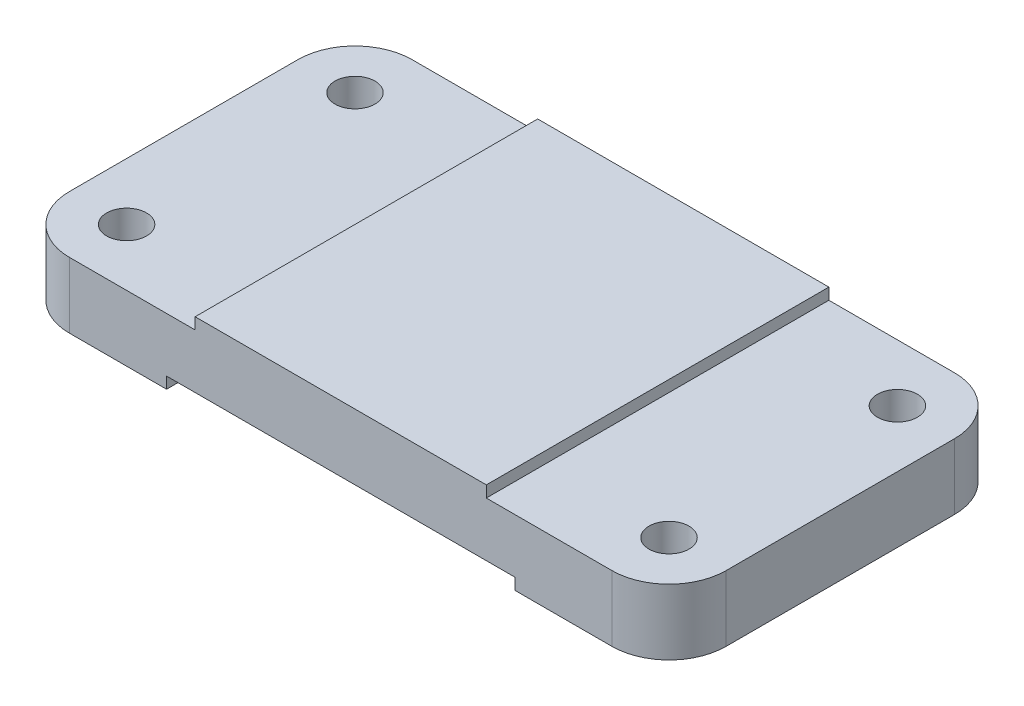
ISO-10303-21;
HEADER;
FILE_DESCRIPTION(('STEP AP214'),'2;1');
FILE_NAME('part.step','',(''),(''),'','','');
FILE_SCHEMA(('AUTOMOTIVE_DESIGN { 1 0 10303 214 1 1 1 1 }'));
ENDSEC;
DATA;
#1=APPLICATION_CONTEXT('core data for automotive mechanical design processes');
#2=APPLICATION_PROTOCOL_DEFINITION('international standard','automotive_design',2000,#1);
#3=PRODUCT_CONTEXT('',#1,'mechanical');
#4=PRODUCT('Part','Part','',(#3));
#5=PRODUCT_RELATED_PRODUCT_CATEGORY('part','',(#4));
#6=PRODUCT_DEFINITION_FORMATION('','',#4);
#7=PRODUCT_DEFINITION_CONTEXT('part definition',#1,'design');
#8=PRODUCT_DEFINITION('design','',#6,#7);
#9=PRODUCT_DEFINITION_SHAPE('','',#8);
#10=(LENGTH_UNIT() NAMED_UNIT(*) SI_UNIT(.MILLI.,.METRE.));
#11=(NAMED_UNIT(*) PLANE_ANGLE_UNIT() SI_UNIT($,.RADIAN.));
#12=(NAMED_UNIT(*) SI_UNIT($,.STERADIAN.) SOLID_ANGLE_UNIT());
#13=UNCERTAINTY_MEASURE_WITH_UNIT(LENGTH_MEASURE(1.E-05),#10,'distance_accuracy_value','');
#14=(GEOMETRIC_REPRESENTATION_CONTEXT(3) GLOBAL_UNCERTAINTY_ASSIGNED_CONTEXT((#13)) GLOBAL_UNIT_ASSIGNED_CONTEXT((#10,
#11,#12)) REPRESENTATION_CONTEXT('',''));
#15=CARTESIAN_POINT('',(0.,0.,0.));
#16=DIRECTION('',(0.,0.,1.));
#17=DIRECTION('',(1.,0.,0.));
#18=AXIS2_PLACEMENT_3D('',#15,#16,#17);
#19=CARTESIAN_POINT('',(95.,0.,-40.));
#20=DIRECTION('',(0.,-1.,0.));
#21=DIRECTION('',(0.,0.,-1.));
#22=AXIS2_PLACEMENT_3D('',#19,#20,#21);
#23=PLANE('',#22);
#24=CARTESIAN_POINT('',(95.,0.,-40.));
#25=DIRECTION('',(0.,1.,0.));
#26=DIRECTION('',(0.,0.,1.));
#27=AXIS2_PLACEMENT_3D('',#24,#25,#26);
#28=CIRCLE('',#27,6.99999999999999);
#29=CARTESIAN_POINT('',(95.,0.,-33.));
#30=VERTEX_POINT('',#29);
#31=EDGE_CURVE('E417',#30,#30,#28,.T.);
#32=ORIENTED_EDGE('',*,*,#31,.T.);
#33=EDGE_LOOP('',(#32));
#34=FACE_BOUND('',#33,.T.);
#35=CARTESIAN_POINT('',(95.,0.,40.));
#36=DIRECTION('',(0.,1.,0.));
#37=DIRECTION('',(0.,0.,1.));
#38=AXIS2_PLACEMENT_3D('',#35,#36,#37);
#39=CIRCLE('',#38,6.99999999999999);
#40=CARTESIAN_POINT('',(95.,0.,47.));
#41=VERTEX_POINT('',#40);
#42=EDGE_CURVE('E196',#41,#41,#39,.T.);
#43=ORIENTED_EDGE('',*,*,#42,.T.);
#44=EDGE_LOOP('',(#43));
#45=FACE_BOUND('',#44,.T.);
#46=DIRECTION('',(0.,0.,1.));
#47=VECTOR('',#46,1.);
#48=CARTESIAN_POINT('',(61.,0.,60.));
#49=LINE('',#48,#47);
#50=CARTESIAN_POINT('',(61.,0.,-60.));
#51=VERTEX_POINT('',#50);
#52=CARTESIAN_POINT('',(61.,0.,60.));
#53=VERTEX_POINT('',#52);
#54=EDGE_CURVE('E166',#51,#53,#49,.T.);
#55=ORIENTED_EDGE('',*,*,#54,.F.);
#56=DIRECTION('',(-1.,0.,0.));
#57=VECTOR('',#56,1.);
#58=CARTESIAN_POINT('',(-95.,0.,-60.));
#59=LINE('',#58,#57);
#60=CARTESIAN_POINT('',(95.,0.,-60.));
#61=VERTEX_POINT('',#60);
#62=EDGE_CURVE('E277',#61,#51,#59,.T.);
#63=ORIENTED_EDGE('',*,*,#62,.F.);
#64=CARTESIAN_POINT('',(95.,0.,-40.));
#65=DIRECTION('',(0.,1.,0.));
#66=DIRECTION('',(0.,0.,-1.));
#67=AXIS2_PLACEMENT_3D('',#64,#65,#66);
#68=CIRCLE('',#67,20.);
#69=CARTESIAN_POINT('',(115.,0.,-40.));
#70=VERTEX_POINT('',#69);
#71=EDGE_CURVE('E243',#70,#61,#68,.T.);
#72=ORIENTED_EDGE('',*,*,#71,.F.);
#73=DIRECTION('',(0.,0.,-1.));
#74=VECTOR('',#73,1.);
#75=CARTESIAN_POINT('',(115.,0.,-40.));
#76=LINE('',#75,#74);
#77=CARTESIAN_POINT('',(115.,0.,40.));
#78=VERTEX_POINT('',#77);
#79=EDGE_CURVE('E249',#78,#70,#76,.T.);
#80=ORIENTED_EDGE('',*,*,#79,.F.);
#81=CARTESIAN_POINT('',(95.,0.,40.));
#82=DIRECTION('',(0.,1.,0.));
#83=DIRECTION('',(0.,0.,-1.));
#84=AXIS2_PLACEMENT_3D('',#81,#82,#83);
#85=CIRCLE('',#84,20.);
#86=CARTESIAN_POINT('',(95.,0.,60.));
#87=VERTEX_POINT('',#86);
#88=EDGE_CURVE('E294',#87,#78,#85,.T.);
#89=ORIENTED_EDGE('',*,*,#88,.F.);
#90=DIRECTION('',(1.,0.,0.));
#91=VECTOR('',#90,1.);
#92=CARTESIAN_POINT('',(-95.,0.,60.));
#93=LINE('',#92,#91);
#94=EDGE_CURVE('E290',#53,#87,#93,.T.);
#95=ORIENTED_EDGE('',*,*,#94,.F.);
#96=EDGE_LOOP('',(#55,#63,#72,#80,#89,#95));
#97=FACE_BOUND('',#96,.T.);
#98=ADVANCED_FACE('F47',(#34,#45,#97),#23,.T.);
#99=CARTESIAN_POINT('',(95.,23.,-40.));
#100=DIRECTION('',(0.,-1.,0.));
#101=DIRECTION('',(0.,0.,-1.));
#102=AXIS2_PLACEMENT_3D('',#99,#100,#101);
#103=PLANE('',#102);
#104=CARTESIAN_POINT('',(95.,23.,-40.));
#105=DIRECTION('',(0.,1.,0.));
#106=DIRECTION('',(0.,0.,1.));
#107=AXIS2_PLACEMENT_3D('',#104,#105,#106);
#108=CIRCLE('',#107,6.99999999999999);
#109=CARTESIAN_POINT('',(95.,23.,-33.));
#110=VERTEX_POINT('',#109);
#111=EDGE_CURVE('E411',#110,#110,#108,.T.);
#112=ORIENTED_EDGE('',*,*,#111,.F.);
#113=EDGE_LOOP('',(#112));
#114=FACE_BOUND('',#113,.T.);
#115=CARTESIAN_POINT('',(95.,23.,40.));
#116=DIRECTION('',(0.,1.,0.));
#117=DIRECTION('',(0.,0.,1.));
#118=AXIS2_PLACEMENT_3D('',#115,#116,#117);
#119=CIRCLE('',#118,6.99999999999999);
#120=CARTESIAN_POINT('',(95.,23.,47.));
#121=VERTEX_POINT('',#120);
#122=EDGE_CURVE('E425',#121,#121,#119,.T.);
#123=ORIENTED_EDGE('',*,*,#122,.F.);
#124=EDGE_LOOP('',(#123));
#125=FACE_BOUND('',#124,.T.);
#126=DIRECTION('',(0.,0.,-1.));
#127=VECTOR('',#126,1.);
#128=CARTESIAN_POINT('',(51.,23.,-60.));
#129=LINE('',#128,#127);
#130=CARTESIAN_POINT('',(51.,23.,60.));
#131=VERTEX_POINT('',#130);
#132=CARTESIAN_POINT('',(51.,23.,-60.));
#133=VERTEX_POINT('',#132);
#134=EDGE_CURVE('E71',#131,#133,#129,.T.);
#135=ORIENTED_EDGE('',*,*,#134,.F.);
#136=DIRECTION('',(1.,0.,0.));
#137=VECTOR('',#136,1.);
#138=CARTESIAN_POINT('',(-95.,23.,60.));
#139=LINE('',#138,#137);
#140=CARTESIAN_POINT('',(95.,23.,60.));
#141=VERTEX_POINT('',#140);
#142=EDGE_CURVE('E262',#131,#141,#139,.T.);
#143=ORIENTED_EDGE('',*,*,#142,.T.);
#144=CARTESIAN_POINT('',(95.,23.,40.));
#145=DIRECTION('',(0.,1.,0.));
#146=DIRECTION('',(0.,0.,-1.));
#147=AXIS2_PLACEMENT_3D('',#144,#145,#146);
#148=CIRCLE('',#147,20.);
#149=CARTESIAN_POINT('',(115.,23.,40.));
#150=VERTEX_POINT('',#149);
#151=EDGE_CURVE('E266',#141,#150,#148,.T.);
#152=ORIENTED_EDGE('',*,*,#151,.T.);
#153=DIRECTION('',(0.,0.,-1.));
#154=VECTOR('',#153,1.);
#155=CARTESIAN_POINT('',(115.,23.,-40.));
#156=LINE('',#155,#154);
#157=CARTESIAN_POINT('',(115.,23.,-40.));
#158=VERTEX_POINT('',#157);
#159=EDGE_CURVE('E269',#150,#158,#156,.T.);
#160=ORIENTED_EDGE('',*,*,#159,.T.);
#161=CARTESIAN_POINT('',(95.,23.,-40.));
#162=DIRECTION('',(0.,1.,0.));
#163=DIRECTION('',(0.,0.,-1.));
#164=AXIS2_PLACEMENT_3D('',#161,#162,#163);
#165=CIRCLE('',#164,20.);
#166=CARTESIAN_POINT('',(95.,23.,-60.));
#167=VERTEX_POINT('',#166);
#168=EDGE_CURVE('E244',#158,#167,#165,.T.);
#169=ORIENTED_EDGE('',*,*,#168,.T.);
#170=DIRECTION('',(-1.,0.,0.));
#171=VECTOR('',#170,1.);
#172=CARTESIAN_POINT('',(-95.,23.,-60.));
#173=LINE('',#172,#171);
#174=EDGE_CURVE('E250',#167,#133,#173,.T.);
#175=ORIENTED_EDGE('',*,*,#174,.T.);
#176=EDGE_LOOP('',(#135,#143,#152,#160,#169,#175));
#177=FACE_BOUND('',#176,.T.);
#178=ADVANCED_FACE('F369',(#114,#125,#177),#103,.F.);
#179=CARTESIAN_POINT('',(-95.,23.,-40.));
#180=DIRECTION('',(0.,1.,0.));
#181=DIRECTION('',(0.,0.,1.));
#182=AXIS2_PLACEMENT_3D('',#179,#180,#181);
#183=CIRCLE('',#182,6.99999999999999);
#184=CARTESIAN_POINT('',(-95.,23.,-33.));
#185=VERTEX_POINT('',#184);
#186=EDGE_CURVE('E677',#185,#185,#183,.T.);
#187=ORIENTED_EDGE('',*,*,#186,.F.);
#188=EDGE_LOOP('',(#187));
#189=FACE_BOUND('',#188,.T.);
#190=CARTESIAN_POINT('',(-95.,23.,40.));
#191=DIRECTION('',(0.,1.,0.));
#192=DIRECTION('',(0.,0.,1.));
#193=AXIS2_PLACEMENT_3D('',#190,#191,#192);
#194=CIRCLE('',#193,6.99999999999999);
#195=CARTESIAN_POINT('',(-95.,23.,47.));
#196=VERTEX_POINT('',#195);
#197=EDGE_CURVE('E412',#196,#196,#194,.T.);
#198=ORIENTED_EDGE('',*,*,#197,.F.);
#199=EDGE_LOOP('',(#198));
#200=FACE_BOUND('',#199,.T.);
#201=DIRECTION('',(0.,0.,1.));
#202=VECTOR('',#201,1.);
#203=CARTESIAN_POINT('',(-51.,23.,-60.));
#204=LINE('',#203,#202);
#205=CARTESIAN_POINT('',(-51.,23.,-60.));
#206=VERTEX_POINT('',#205);
#207=CARTESIAN_POINT('',(-51.,23.,60.));
#208=VERTEX_POINT('',#207);
#209=EDGE_CURVE('E213',#206,#208,#204,.T.);
#210=ORIENTED_EDGE('',*,*,#209,.F.);
#211=CARTESIAN_POINT('',(-95.,23.,-60.));
#212=VERTEX_POINT('',#211);
#213=EDGE_CURVE('E248',#206,#212,#173,.T.);
#214=ORIENTED_EDGE('',*,*,#213,.T.);
#215=CARTESIAN_POINT('',(-95.,23.,-40.));
#216=DIRECTION('',(0.,1.,0.));
#217=DIRECTION('',(0.,0.,1.));
#218=AXIS2_PLACEMENT_3D('',#215,#216,#217);
#219=CIRCLE('',#218,20.);
#220=CARTESIAN_POINT('',(-115.,23.,-40.));
#221=VERTEX_POINT('',#220);
#222=EDGE_CURVE('E253',#212,#221,#219,.T.);
#223=ORIENTED_EDGE('',*,*,#222,.T.);
#224=DIRECTION('',(0.,0.,1.));
#225=VECTOR('',#224,1.);
#226=CARTESIAN_POINT('',(-115.,23.,-40.));
#227=LINE('',#226,#225);
#228=CARTESIAN_POINT('',(-115.,23.,40.));
#229=VERTEX_POINT('',#228);
#230=EDGE_CURVE('E256',#221,#229,#227,.T.);
#231=ORIENTED_EDGE('',*,*,#230,.T.);
#232=CARTESIAN_POINT('',(-95.,23.,40.));
#233=DIRECTION('',(0.,1.,0.));
#234=DIRECTION('',(0.,0.,1.));
#235=AXIS2_PLACEMENT_3D('',#232,#233,#234);
#236=CIRCLE('',#235,20.);
#237=CARTESIAN_POINT('',(-95.,23.,60.));
#238=VERTEX_POINT('',#237);
#239=EDGE_CURVE('E259',#229,#238,#236,.T.);
#240=ORIENTED_EDGE('',*,*,#239,.T.);
#241=EDGE_CURVE('E263',#238,#208,#139,.T.);
#242=ORIENTED_EDGE('',*,*,#241,.T.);
#243=EDGE_LOOP('',(#210,#214,#223,#231,#240,#242));
#244=FACE_BOUND('',#243,.T.);
#245=ADVANCED_FACE('F347',(#189,#200,#244),#103,.F.);
#246=CARTESIAN_POINT('',(95.,23.,-40.));
#247=DIRECTION('',(0.,-1.,0.));
#248=DIRECTION('',(0.,0.,-1.));
#249=AXIS2_PLACEMENT_3D('',#246,#247,#248);
#250=CYLINDRICAL_SURFACE('',#249,20.);
#251=ORIENTED_EDGE('',*,*,#71,.T.);
#252=DIRECTION('',(0.,-1.,0.));
#253=VECTOR('',#252,1.);
#254=CARTESIAN_POINT('',(95.,23.,-60.));
#255=LINE('',#254,#253);
#256=EDGE_CURVE('E11',#167,#61,#255,.T.);
#257=ORIENTED_EDGE('',*,*,#256,.F.);
#258=ORIENTED_EDGE('',*,*,#168,.F.);
#259=DIRECTION('',(0.,-1.,0.));
#260=VECTOR('',#259,1.);
#261=CARTESIAN_POINT('',(115.,23.,-40.));
#262=LINE('',#261,#260);
#263=EDGE_CURVE('E272',#158,#70,#262,.T.);
#264=ORIENTED_EDGE('',*,*,#263,.T.);
#265=EDGE_LOOP('',(#251,#257,#258,#264));
#266=FACE_BOUND('',#265,.T.);
#267=ADVANCED_FACE('F49',(#266),#250,.T.);
#268=CARTESIAN_POINT('',(-95.,23.,-60.));
#269=DIRECTION('',(0.,0.,1.));
#270=DIRECTION('',(1.,0.,0.));
#271=AXIS2_PLACEMENT_3D('',#268,#269,#270);
#272=PLANE('',#271);
#273=ORIENTED_EDGE('',*,*,#62,.T.);
#274=DIRECTION('',(0.,-1.,0.));
#275=VECTOR('',#274,1.);
#276=CARTESIAN_POINT('',(61.,4.,-60.));
#277=LINE('',#276,#275);
#278=CARTESIAN_POINT('',(61.,4.,-60.));
#279=VERTEX_POINT('',#278);
#280=EDGE_CURVE('E199',#279,#51,#277,.T.);
#281=ORIENTED_EDGE('',*,*,#280,.F.);
#282=DIRECTION('',(1.,0.,0.));
#283=VECTOR('',#282,1.);
#284=CARTESIAN_POINT('',(-61.,4.,-60.));
#285=LINE('',#284,#283);
#286=CARTESIAN_POINT('',(-61.,4.,-60.));
#287=VERTEX_POINT('',#286);
#288=EDGE_CURVE('E171',#287,#279,#285,.T.);
#289=ORIENTED_EDGE('',*,*,#288,.F.);
#290=DIRECTION('',(0.,-1.,0.));
#291=VECTOR('',#290,1.);
#292=CARTESIAN_POINT('',(-61.,4.,-60.));
#293=LINE('',#292,#291);
#294=CARTESIAN_POINT('',(-61.,0.,-60.));
#295=VERTEX_POINT('',#294);
#296=EDGE_CURVE('E202',#287,#295,#293,.T.);
#297=ORIENTED_EDGE('',*,*,#296,.T.);
#298=CARTESIAN_POINT('',(-95.,0.,-60.));
#299=VERTEX_POINT('',#298);
#300=EDGE_CURVE('E276',#295,#299,#59,.T.);
#301=ORIENTED_EDGE('',*,*,#300,.T.);
#302=DIRECTION('',(0.,-1.,0.));
#303=VECTOR('',#302,1.);
#304=CARTESIAN_POINT('',(-95.,23.,-60.));
#305=LINE('',#304,#303);
#306=EDGE_CURVE('E56',#212,#299,#305,.T.);
#307=ORIENTED_EDGE('',*,*,#306,.F.);
#308=ORIENTED_EDGE('',*,*,#213,.F.);
#309=DIRECTION('',(0.,-1.,0.));
#310=VECTOR('',#309,1.);
#311=CARTESIAN_POINT('',(-51.,27.,-60.));
#312=LINE('',#311,#310);
#313=CARTESIAN_POINT('',(-51.,27.,-60.));
#314=VERTEX_POINT('',#313);
#315=EDGE_CURVE('E235',#314,#206,#312,.T.);
#316=ORIENTED_EDGE('',*,*,#315,.F.);
#317=DIRECTION('',(-1.,0.,0.));
#318=VECTOR('',#317,1.);
#319=CARTESIAN_POINT('',(-51.,27.,-60.));
#320=LINE('',#319,#318);
#321=CARTESIAN_POINT('',(51.,27.,-60.));
#322=VERTEX_POINT('',#321);
#323=EDGE_CURVE('E212',#322,#314,#320,.T.);
#324=ORIENTED_EDGE('',*,*,#323,.F.);
#325=DIRECTION('',(0.,-1.,0.));
#326=VECTOR('',#325,1.);
#327=CARTESIAN_POINT('',(51.,27.,-60.));
#328=LINE('',#327,#326);
#329=EDGE_CURVE('E239',#322,#133,#328,.T.);
#330=ORIENTED_EDGE('',*,*,#329,.T.);
#331=ORIENTED_EDGE('',*,*,#174,.F.);
#332=ORIENTED_EDGE('',*,*,#256,.T.);
#333=EDGE_LOOP('',(#273,#281,#289,#297,#301,#307,#308,#316,#324,#330,#331,#332));
#334=FACE_BOUND('',#333,.T.);
#335=ADVANCED_FACE('F352',(#334),#272,.F.);
#336=CARTESIAN_POINT('',(-95.,23.,-40.));
#337=DIRECTION('',(0.,-1.,0.));
#338=DIRECTION('',(0.,0.,-1.));
#339=AXIS2_PLACEMENT_3D('',#336,#337,#338);
#340=CYLINDRICAL_SURFACE('',#339,20.);
#341=CARTESIAN_POINT('',(-95.,0.,-40.));
#342=DIRECTION('',(0.,1.,0.));
#343=DIRECTION('',(0.,0.,1.));
#344=AXIS2_PLACEMENT_3D('',#341,#342,#343);
#345=CIRCLE('',#344,20.);
#346=CARTESIAN_POINT('',(-115.,0.,-40.));
#347=VERTEX_POINT('',#346);
#348=EDGE_CURVE('E281',#299,#347,#345,.T.);
#349=ORIENTED_EDGE('',*,*,#348,.T.);
#350=DIRECTION('',(0.,-1.,0.));
#351=VECTOR('',#350,1.);
#352=CARTESIAN_POINT('',(-115.,23.,-40.));
#353=LINE('',#352,#351);
#354=EDGE_CURVE('E318',#221,#347,#353,.T.);
#355=ORIENTED_EDGE('',*,*,#354,.F.);
#356=ORIENTED_EDGE('',*,*,#222,.F.);
#357=ORIENTED_EDGE('',*,*,#306,.T.);
#358=EDGE_LOOP('',(#349,#355,#356,#357));
#359=FACE_BOUND('',#358,.T.);
#360=ADVANCED_FACE('F327',(#359),#340,.T.);
#361=CARTESIAN_POINT('',(-115.,23.,-40.));
#362=DIRECTION('',(1.,0.,0.));
#363=DIRECTION('',(0.,0.,-1.));
#364=AXIS2_PLACEMENT_3D('',#361,#362,#363);
#365=PLANE('',#364);
#366=DIRECTION('',(0.,0.,1.));
#367=VECTOR('',#366,1.);
#368=CARTESIAN_POINT('',(-115.,0.,-40.));
#369=LINE('',#368,#367);
#370=CARTESIAN_POINT('',(-115.,0.,40.));
#371=VERTEX_POINT('',#370);
#372=EDGE_CURVE('E284',#347,#371,#369,.T.);
#373=ORIENTED_EDGE('',*,*,#372,.T.);
#374=DIRECTION('',(0.,-1.,0.));
#375=VECTOR('',#374,1.);
#376=CARTESIAN_POINT('',(-115.,23.,40.));
#377=LINE('',#376,#375);
#378=EDGE_CURVE('E314',#229,#371,#377,.T.);
#379=ORIENTED_EDGE('',*,*,#378,.F.);
#380=ORIENTED_EDGE('',*,*,#230,.F.);
#381=ORIENTED_EDGE('',*,*,#354,.T.);
#382=EDGE_LOOP('',(#373,#379,#380,#381));
#383=FACE_BOUND('',#382,.T.);
#384=ADVANCED_FACE('F339',(#383),#365,.F.);
#385=CARTESIAN_POINT('',(-95.,23.,40.));
#386=DIRECTION('',(0.,-1.,0.));
#387=DIRECTION('',(0.,0.,-1.));
#388=AXIS2_PLACEMENT_3D('',#385,#386,#387);
#389=CYLINDRICAL_SURFACE('',#388,20.);
#390=CARTESIAN_POINT('',(-95.,0.,40.));
#391=DIRECTION('',(0.,1.,0.));
#392=DIRECTION('',(0.,0.,1.));
#393=AXIS2_PLACEMENT_3D('',#390,#391,#392);
#394=CIRCLE('',#393,20.);
#395=CARTESIAN_POINT('',(-95.,0.,60.));
#396=VERTEX_POINT('',#395);
#397=EDGE_CURVE('E287',#371,#396,#394,.T.);
#398=ORIENTED_EDGE('',*,*,#397,.T.);
#399=DIRECTION('',(0.,-1.,0.));
#400=VECTOR('',#399,1.);
#401=CARTESIAN_POINT('',(-95.,23.,60.));
#402=LINE('',#401,#400);
#403=EDGE_CURVE('E310',#238,#396,#402,.T.);
#404=ORIENTED_EDGE('',*,*,#403,.F.);
#405=ORIENTED_EDGE('',*,*,#239,.F.);
#406=ORIENTED_EDGE('',*,*,#378,.T.);
#407=EDGE_LOOP('',(#398,#404,#405,#406));
#408=FACE_BOUND('',#407,.T.);
#409=ADVANCED_FACE('F343',(#408),#389,.T.);
#410=CARTESIAN_POINT('',(-95.,23.,60.));
#411=DIRECTION('',(0.,0.,-1.));
#412=DIRECTION('',(-1.,0.,0.));
#413=AXIS2_PLACEMENT_3D('',#410,#411,#412);
#414=PLANE('',#413);
#415=DIRECTION('',(-1.,0.,0.));
#416=VECTOR('',#415,1.);
#417=CARTESIAN_POINT('',(-61.,4.,60.));
#418=LINE('',#417,#416);
#419=CARTESIAN_POINT('',(61.,4.,60.));
#420=VERTEX_POINT('',#419);
#421=CARTESIAN_POINT('',(-61.,4.,60.));
#422=VERTEX_POINT('',#421);
#423=EDGE_CURVE('E177',#420,#422,#418,.T.);
#424=ORIENTED_EDGE('',*,*,#423,.F.);
#425=DIRECTION('',(0.,-1.,0.));
#426=VECTOR('',#425,1.);
#427=CARTESIAN_POINT('',(61.,4.,60.));
#428=LINE('',#427,#426);
#429=EDGE_CURVE('E160',#420,#53,#428,.T.);
#430=ORIENTED_EDGE('',*,*,#429,.T.);
#431=ORIENTED_EDGE('',*,*,#94,.T.);
#432=DIRECTION('',(0.,-1.,0.));
#433=VECTOR('',#432,1.);
#434=CARTESIAN_POINT('',(95.,23.,60.));
#435=LINE('',#434,#433);
#436=EDGE_CURVE('E306',#141,#87,#435,.T.);
#437=ORIENTED_EDGE('',*,*,#436,.F.);
#438=ORIENTED_EDGE('',*,*,#142,.F.);
#439=DIRECTION('',(0.,-1.,0.));
#440=VECTOR('',#439,1.);
#441=CARTESIAN_POINT('',(51.,27.,60.));
#442=LINE('',#441,#440);
#443=CARTESIAN_POINT('',(51.,27.,60.));
#444=VERTEX_POINT('',#443);
#445=EDGE_CURVE('E222',#444,#131,#442,.T.);
#446=ORIENTED_EDGE('',*,*,#445,.F.);
#447=DIRECTION('',(1.,0.,0.));
#448=VECTOR('',#447,1.);
#449=CARTESIAN_POINT('',(-51.,27.,60.));
#450=LINE('',#449,#448);
#451=CARTESIAN_POINT('',(-51.,27.,60.));
#452=VERTEX_POINT('',#451);
#453=EDGE_CURVE('E219',#452,#444,#450,.T.);
#454=ORIENTED_EDGE('',*,*,#453,.F.);
#455=DIRECTION('',(0.,-1.,0.));
#456=VECTOR('',#455,1.);
#457=CARTESIAN_POINT('',(-51.,27.,60.));
#458=LINE('',#457,#456);
#459=EDGE_CURVE('E231',#452,#208,#458,.T.);
#460=ORIENTED_EDGE('',*,*,#459,.T.);
#461=ORIENTED_EDGE('',*,*,#241,.F.);
#462=ORIENTED_EDGE('',*,*,#403,.T.);
#463=CARTESIAN_POINT('',(-61.,0.,60.));
#464=VERTEX_POINT('',#463);
#465=EDGE_CURVE('E291',#396,#464,#93,.T.);
#466=ORIENTED_EDGE('',*,*,#465,.T.);
#467=DIRECTION('',(0.,-1.,0.));
#468=VECTOR('',#467,1.);
#469=CARTESIAN_POINT('',(-61.,4.,60.));
#470=LINE('',#469,#468);
#471=EDGE_CURVE('E63',#422,#464,#470,.T.);
#472=ORIENTED_EDGE('',*,*,#471,.F.);
#473=EDGE_LOOP('',(#424,#430,#431,#437,#438,#446,#454,#460,#461,#462,#466,#472));
#474=FACE_BOUND('',#473,.T.);
#475=ADVANCED_FACE('F183',(#474),#414,.F.);
#476=CARTESIAN_POINT('',(95.,23.,40.));
#477=DIRECTION('',(0.,-1.,0.));
#478=DIRECTION('',(0.,0.,-1.));
#479=AXIS2_PLACEMENT_3D('',#476,#477,#478);
#480=CYLINDRICAL_SURFACE('',#479,20.);
#481=ORIENTED_EDGE('',*,*,#88,.T.);
#482=DIRECTION('',(0.,-1.,0.));
#483=VECTOR('',#482,1.);
#484=CARTESIAN_POINT('',(115.,23.,40.));
#485=LINE('',#484,#483);
#486=EDGE_CURVE('E302',#150,#78,#485,.T.);
#487=ORIENTED_EDGE('',*,*,#486,.F.);
#488=ORIENTED_EDGE('',*,*,#151,.F.);
#489=ORIENTED_EDGE('',*,*,#436,.T.);
#490=EDGE_LOOP('',(#481,#487,#488,#489));
#491=FACE_BOUND('',#490,.T.);
#492=ADVANCED_FACE('F374',(#491),#480,.T.);
#493=CARTESIAN_POINT('',(115.,23.,-40.));
#494=DIRECTION('',(-1.,0.,0.));
#495=DIRECTION('',(0.,0.,1.));
#496=AXIS2_PLACEMENT_3D('',#493,#494,#495);
#497=PLANE('',#496);
#498=ORIENTED_EDGE('',*,*,#79,.T.);
#499=ORIENTED_EDGE('',*,*,#263,.F.);
#500=ORIENTED_EDGE('',*,*,#159,.F.);
#501=ORIENTED_EDGE('',*,*,#486,.T.);
#502=EDGE_LOOP('',(#498,#499,#500,#501));
#503=FACE_BOUND('',#502,.T.);
#504=ADVANCED_FACE('F378',(#503),#497,.F.);
#505=CARTESIAN_POINT('',(-95.,0.,-40.));
#506=DIRECTION('',(0.,1.,0.));
#507=DIRECTION('',(0.,0.,1.));
#508=AXIS2_PLACEMENT_3D('',#505,#506,#507);
#509=CIRCLE('',#508,6.99999999999999);
#510=CARTESIAN_POINT('',(-95.,0.,-33.));
#511=VERTEX_POINT('',#510);
#512=EDGE_CURVE('E405',#511,#511,#509,.T.);
#513=ORIENTED_EDGE('',*,*,#512,.T.);
#514=EDGE_LOOP('',(#513));
#515=FACE_BOUND('',#514,.T.);
#516=CARTESIAN_POINT('',(-95.,0.,40.));
#517=DIRECTION('',(0.,1.,0.));
#518=DIRECTION('',(0.,0.,1.));
#519=AXIS2_PLACEMENT_3D('',#516,#517,#518);
#520=CIRCLE('',#519,6.99999999999999);
#521=CARTESIAN_POINT('',(-95.,0.,47.));
#522=VERTEX_POINT('',#521);
#523=EDGE_CURVE('E408',#522,#522,#520,.T.);
#524=ORIENTED_EDGE('',*,*,#523,.T.);
#525=EDGE_LOOP('',(#524));
#526=FACE_BOUND('',#525,.T.);
#527=DIRECTION('',(0.,0.,-1.));
#528=VECTOR('',#527,1.);
#529=CARTESIAN_POINT('',(-61.,0.,60.));
#530=LINE('',#529,#528);
#531=EDGE_CURVE('E181',#464,#295,#530,.T.);
#532=ORIENTED_EDGE('',*,*,#531,.F.);
#533=ORIENTED_EDGE('',*,*,#465,.F.);
#534=ORIENTED_EDGE('',*,*,#397,.F.);
#535=ORIENTED_EDGE('',*,*,#372,.F.);
#536=ORIENTED_EDGE('',*,*,#348,.F.);
#537=ORIENTED_EDGE('',*,*,#300,.F.);
#538=EDGE_LOOP('',(#532,#533,#534,#535,#536,#537));
#539=FACE_BOUND('',#538,.T.);
#540=ADVANCED_FACE('F334',(#515,#526,#539),#23,.T.);
#541=CARTESIAN_POINT('',(51.,27.,-60.));
#542=DIRECTION('',(-1.,0.,0.));
#543=DIRECTION('',(0.,0.,1.));
#544=AXIS2_PLACEMENT_3D('',#541,#542,#543);
#545=PLANE('',#544);
#546=ORIENTED_EDGE('',*,*,#134,.T.);
#547=ORIENTED_EDGE('',*,*,#329,.F.);
#548=DIRECTION('',(0.,0.,-1.));
#549=VECTOR('',#548,1.);
#550=CARTESIAN_POINT('',(51.,27.,-60.));
#551=LINE('',#550,#549);
#552=EDGE_CURVE('E208',#444,#322,#551,.T.);
#553=ORIENTED_EDGE('',*,*,#552,.F.);
#554=ORIENTED_EDGE('',*,*,#445,.T.);
#555=EDGE_LOOP('',(#546,#547,#553,#554));
#556=FACE_BOUND('',#555,.T.);
#557=ADVANCED_FACE('F365',(#556),#545,.F.);
#558=CARTESIAN_POINT('',(-51.,27.,-60.));
#559=DIRECTION('',(1.,0.,0.));
#560=DIRECTION('',(0.,0.,-1.));
#561=AXIS2_PLACEMENT_3D('',#558,#559,#560);
#562=PLANE('',#561);
#563=ORIENTED_EDGE('',*,*,#209,.T.);
#564=ORIENTED_EDGE('',*,*,#459,.F.);
#565=DIRECTION('',(0.,0.,1.));
#566=VECTOR('',#565,1.);
#567=CARTESIAN_POINT('',(-51.,27.,-60.));
#568=LINE('',#567,#566);
#569=EDGE_CURVE('E216',#314,#452,#568,.T.);
#570=ORIENTED_EDGE('',*,*,#569,.F.);
#571=ORIENTED_EDGE('',*,*,#315,.T.);
#572=EDGE_LOOP('',(#563,#564,#570,#571));
#573=FACE_BOUND('',#572,.T.);
#574=ADVANCED_FACE('F359',(#573),#562,.F.);
#575=CARTESIAN_POINT('',(0.,27.,0.));
#576=DIRECTION('',(0.,1.,0.));
#577=DIRECTION('',(0.,0.,1.));
#578=AXIS2_PLACEMENT_3D('',#575,#576,#577);
#579=PLANE('',#578);
#580=ORIENTED_EDGE('',*,*,#552,.T.);
#581=ORIENTED_EDGE('',*,*,#323,.T.);
#582=ORIENTED_EDGE('',*,*,#569,.T.);
#583=ORIENTED_EDGE('',*,*,#453,.T.);
#584=EDGE_LOOP('',(#580,#581,#582,#583));
#585=FACE_BOUND('',#584,.T.);
#586=ADVANCED_FACE('F363',(#585),#579,.T.);
#587=CARTESIAN_POINT('',(61.,4.,60.));
#588=DIRECTION('',(1.,0.,0.));
#589=DIRECTION('',(0.,0.,-1.));
#590=AXIS2_PLACEMENT_3D('',#587,#588,#589);
#591=PLANE('',#590);
#592=ORIENTED_EDGE('',*,*,#54,.T.);
#593=ORIENTED_EDGE('',*,*,#429,.F.);
#594=DIRECTION('',(0.,0.,1.));
#595=VECTOR('',#594,1.);
#596=CARTESIAN_POINT('',(61.,4.,60.));
#597=LINE('',#596,#595);
#598=EDGE_CURVE('E163',#279,#420,#597,.T.);
#599=ORIENTED_EDGE('',*,*,#598,.F.);
#600=ORIENTED_EDGE('',*,*,#280,.T.);
#601=EDGE_LOOP('',(#592,#593,#599,#600));
#602=FACE_BOUND('',#601,.T.);
#603=ADVANCED_FACE('F162',(#602),#591,.F.);
#604=CARTESIAN_POINT('',(-61.,4.,60.));
#605=DIRECTION('',(-1.,0.,0.));
#606=DIRECTION('',(0.,0.,1.));
#607=AXIS2_PLACEMENT_3D('',#604,#605,#606);
#608=PLANE('',#607);
#609=ORIENTED_EDGE('',*,*,#531,.T.);
#610=ORIENTED_EDGE('',*,*,#296,.F.);
#611=DIRECTION('',(0.,0.,-1.));
#612=VECTOR('',#611,1.);
#613=CARTESIAN_POINT('',(-61.,4.,60.));
#614=LINE('',#613,#612);
#615=EDGE_CURVE('E186',#422,#287,#614,.T.);
#616=ORIENTED_EDGE('',*,*,#615,.F.);
#617=ORIENTED_EDGE('',*,*,#471,.T.);
#618=EDGE_LOOP('',(#609,#610,#616,#617));
#619=FACE_BOUND('',#618,.T.);
#620=ADVANCED_FACE('F353',(#619),#608,.F.);
#621=CARTESIAN_POINT('',(0.,4.,0.));
#622=DIRECTION('',(0.,-1.,0.));
#623=DIRECTION('',(0.,0.,-1.));
#624=AXIS2_PLACEMENT_3D('',#621,#622,#623);
#625=PLANE('',#624);
#626=ORIENTED_EDGE('',*,*,#598,.T.);
#627=ORIENTED_EDGE('',*,*,#423,.T.);
#628=ORIENTED_EDGE('',*,*,#615,.T.);
#629=ORIENTED_EDGE('',*,*,#288,.T.);
#630=EDGE_LOOP('',(#626,#627,#628,#629));
#631=FACE_BOUND('',#630,.T.);
#632=ADVANCED_FACE('F175',(#631),#625,.T.);
#633=CARTESIAN_POINT('',(95.,23.,40.));
#634=DIRECTION('',(0.,1.,0.));
#635=DIRECTION('',(0.,0.,1.));
#636=AXIS2_PLACEMENT_3D('',#633,#634,#635);
#637=CYLINDRICAL_SURFACE('',#636,6.99999999999999);
#638=ORIENTED_EDGE('',*,*,#42,.F.);
#639=EDGE_LOOP('',(#638));
#640=FACE_BOUND('',#639,.T.);
#641=ORIENTED_EDGE('',*,*,#122,.T.);
#642=EDGE_LOOP('',(#641));
#643=FACE_BOUND('',#642,.T.);
#644=ADVANCED_FACE('F432',(#640,#643),#637,.F.);
#645=CARTESIAN_POINT('',(95.,23.,-40.));
#646=DIRECTION('',(0.,1.,0.));
#647=DIRECTION('',(0.,0.,1.));
#648=AXIS2_PLACEMENT_3D('',#645,#646,#647);
#649=CYLINDRICAL_SURFACE('',#648,6.99999999999999);
#650=ORIENTED_EDGE('',*,*,#31,.F.);
#651=EDGE_LOOP('',(#650));
#652=FACE_BOUND('',#651,.T.);
#653=ORIENTED_EDGE('',*,*,#111,.T.);
#654=EDGE_LOOP('',(#653));
#655=FACE_BOUND('',#654,.T.);
#656=ADVANCED_FACE('F435',(#652,#655),#649,.F.);
#657=CARTESIAN_POINT('',(-95.,23.,40.));
#658=DIRECTION('',(0.,1.,0.));
#659=DIRECTION('',(0.,0.,1.));
#660=AXIS2_PLACEMENT_3D('',#657,#658,#659);
#661=CYLINDRICAL_SURFACE('',#660,6.99999999999999);
#662=ORIENTED_EDGE('',*,*,#523,.F.);
#663=EDGE_LOOP('',(#662));
#664=FACE_BOUND('',#663,.T.);
#665=ORIENTED_EDGE('',*,*,#197,.T.);
#666=EDGE_LOOP('',(#665));
#667=FACE_BOUND('',#666,.T.);
#668=ADVANCED_FACE('F443',(#664,#667),#661,.F.);
#669=CARTESIAN_POINT('',(-95.,23.,-40.));
#670=DIRECTION('',(0.,1.,0.));
#671=DIRECTION('',(0.,0.,1.));
#672=AXIS2_PLACEMENT_3D('',#669,#670,#671);
#673=CYLINDRICAL_SURFACE('',#672,6.99999999999999);
#674=ORIENTED_EDGE('',*,*,#512,.F.);
#675=EDGE_LOOP('',(#674));
#676=FACE_BOUND('',#675,.T.);
#677=ORIENTED_EDGE('',*,*,#186,.T.);
#678=EDGE_LOOP('',(#677));
#679=FACE_BOUND('',#678,.T.);
#680=ADVANCED_FACE('F539',(#676,#679),#673,.F.);
#681=CLOSED_SHELL('',(#98,#178,#245,#267,#335,#360,#384,#409,#475,#492,#504,#540,#557,#574,#586,
#603,#620,#632,#644,#656,#668,#680));
#682=MANIFOLD_SOLID_BREP('B2',#681);
#683=ADVANCED_BREP_SHAPE_REPRESENTATION('',(#18,#682),#14);
#684=SHAPE_DEFINITION_REPRESENTATION(#9,#683);
ENDSEC;
END-ISO-10303-21;
